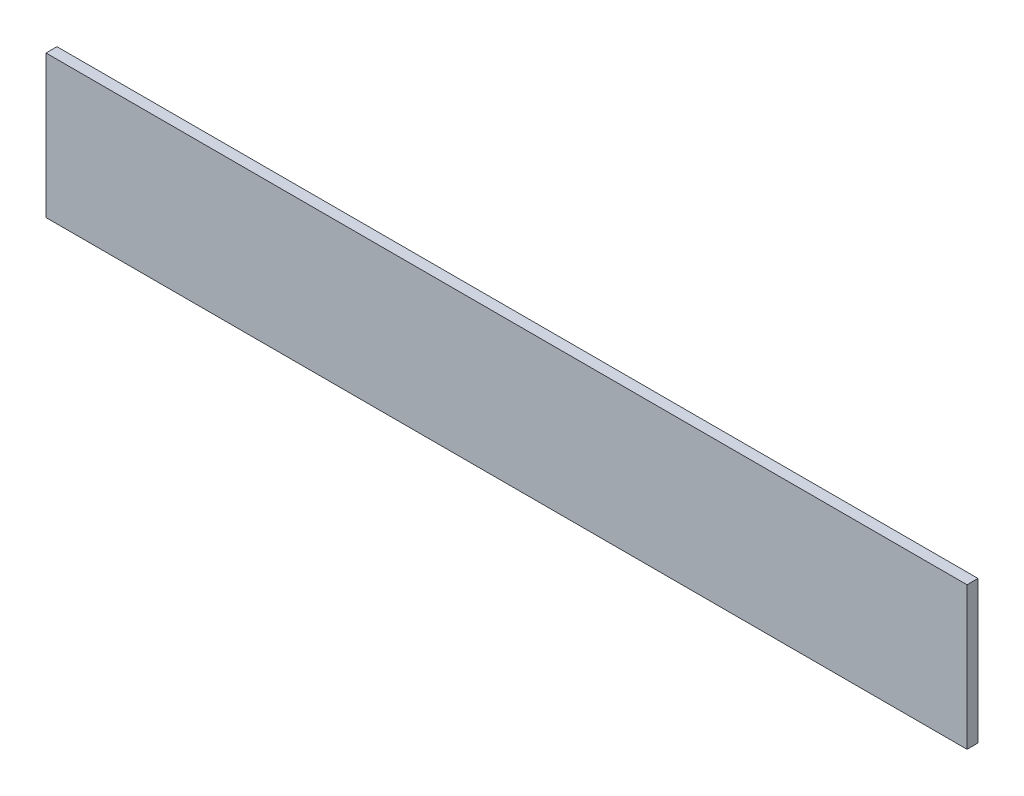
ISO-10303-21;
HEADER;
FILE_DESCRIPTION(('STEP AP214'),'2;1');
FILE_NAME('part.step','',(''),(''),'','','');
FILE_SCHEMA(('AUTOMOTIVE_DESIGN { 1 0 10303 214 1 1 1 1 }'));
ENDSEC;
DATA;
#1=APPLICATION_CONTEXT('core data for automotive mechanical design processes');
#2=APPLICATION_PROTOCOL_DEFINITION('international standard','automotive_design',2000,#1);
#3=PRODUCT_CONTEXT('',#1,'mechanical');
#4=PRODUCT('Part','Part','',(#3));
#5=PRODUCT_RELATED_PRODUCT_CATEGORY('part','',(#4));
#6=PRODUCT_DEFINITION_FORMATION('','',#4);
#7=PRODUCT_DEFINITION_CONTEXT('part definition',#1,'design');
#8=PRODUCT_DEFINITION('design','',#6,#7);
#9=PRODUCT_DEFINITION_SHAPE('','',#8);
#10=(LENGTH_UNIT() NAMED_UNIT(*) SI_UNIT(.MILLI.,.METRE.));
#11=(NAMED_UNIT(*) PLANE_ANGLE_UNIT() SI_UNIT($,.RADIAN.));
#12=(NAMED_UNIT(*) SI_UNIT($,.STERADIAN.) SOLID_ANGLE_UNIT());
#13=UNCERTAINTY_MEASURE_WITH_UNIT(LENGTH_MEASURE(1.E-05),#10,'distance_accuracy_value','');
#14=(GEOMETRIC_REPRESENTATION_CONTEXT(3) GLOBAL_UNCERTAINTY_ASSIGNED_CONTEXT((#13)) GLOBAL_UNIT_ASSIGNED_CONTEXT((#10,
#11,#12)) REPRESENTATION_CONTEXT('',''));
#15=CARTESIAN_POINT('',(0.,0.,0.));
#16=DIRECTION('',(0.,0.,1.));
#17=DIRECTION('',(1.,0.,0.));
#18=AXIS2_PLACEMENT_3D('',#15,#16,#17);
#19=CARTESIAN_POINT('',(0.,0.,5.));
#20=DIRECTION('',(1.,0.,0.));
#21=DIRECTION('',(0.,1.,0.));
#22=AXIS2_PLACEMENT_3D('',#19,#20,#21);
#23=PLANE('',#22);
#24=DIRECTION('',(0.,-1.,0.));
#25=VECTOR('',#24,1.);
#26=CARTESIAN_POINT('',(0.,0.,0.));
#27=LINE('',#26,#25);
#28=CARTESIAN_POINT('',(0.,0.,0.));
#29=VERTEX_POINT('',#28);
#30=CARTESIAN_POINT('',(0.,-65.,0.));
#31=VERTEX_POINT('',#30);
#32=EDGE_CURVE('E100',#29,#31,#27,.T.);
#33=ORIENTED_EDGE('',*,*,#32,.T.);
#34=DIRECTION('',(0.,0.,-1.));
#35=VECTOR('',#34,1.);
#36=CARTESIAN_POINT('',(0.,-65.,5.));
#37=LINE('',#36,#35);
#38=CARTESIAN_POINT('',(0.,-65.,5.));
#39=VERTEX_POINT('',#38);
#40=EDGE_CURVE('E11',#39,#31,#37,.T.);
#41=ORIENTED_EDGE('',*,*,#40,.F.);
#42=DIRECTION('',(0.,-1.,0.));
#43=VECTOR('',#42,1.);
#44=CARTESIAN_POINT('',(0.,0.,5.));
#45=LINE('',#44,#43);
#46=CARTESIAN_POINT('',(0.,0.,5.));
#47=VERTEX_POINT('',#46);
#48=EDGE_CURVE('E88',#47,#39,#45,.T.);
#49=ORIENTED_EDGE('',*,*,#48,.F.);
#50=DIRECTION('',(0.,0.,-1.));
#51=VECTOR('',#50,1.);
#52=CARTESIAN_POINT('',(0.,0.,5.));
#53=LINE('',#52,#51);
#54=EDGE_CURVE('E96',#47,#29,#53,.T.);
#55=ORIENTED_EDGE('',*,*,#54,.T.);
#56=EDGE_LOOP('',(#33,#41,#49,#55));
#57=FACE_BOUND('',#56,.T.);
#58=ADVANCED_FACE('F37',(#57),#23,.F.);
#59=CARTESIAN_POINT('',(0.,-65.,5.));
#60=DIRECTION('',(0.,1.,0.));
#61=DIRECTION('',(0.,0.,1.));
#62=AXIS2_PLACEMENT_3D('',#59,#60,#61);
#63=PLANE('',#62);
#64=DIRECTION('',(1.,0.,0.));
#65=VECTOR('',#64,1.);
#66=CARTESIAN_POINT('',(0.,-65.,0.));
#67=LINE('',#66,#65);
#68=CARTESIAN_POINT('',(420.,-65.,0.));
#69=VERTEX_POINT('',#68);
#70=EDGE_CURVE('E92',#31,#69,#67,.T.);
#71=ORIENTED_EDGE('',*,*,#70,.T.);
#72=DIRECTION('',(0.,0.,-1.));
#73=VECTOR('',#72,1.);
#74=CARTESIAN_POINT('',(420.,-65.,5.));
#75=LINE('',#74,#73);
#76=CARTESIAN_POINT('',(420.,-65.,5.));
#77=VERTEX_POINT('',#76);
#78=EDGE_CURVE('E45',#77,#69,#75,.T.);
#79=ORIENTED_EDGE('',*,*,#78,.F.);
#80=DIRECTION('',(1.,0.,0.));
#81=VECTOR('',#80,1.);
#82=CARTESIAN_POINT('',(0.,-65.,5.));
#83=LINE('',#82,#81);
#84=EDGE_CURVE('E83',#39,#77,#83,.T.);
#85=ORIENTED_EDGE('',*,*,#84,.F.);
#86=ORIENTED_EDGE('',*,*,#40,.T.);
#87=EDGE_LOOP('',(#71,#79,#85,#86));
#88=FACE_BOUND('',#87,.T.);
#89=ADVANCED_FACE('F91',(#88),#63,.F.);
#90=CARTESIAN_POINT('',(420.,0.,5.));
#91=DIRECTION('',(-1.,0.,0.));
#92=DIRECTION('',(0.,0.,1.));
#93=AXIS2_PLACEMENT_3D('',#90,#91,#92);
#94=PLANE('',#93);
#95=DIRECTION('',(0.,1.,0.));
#96=VECTOR('',#95,1.);
#97=CARTESIAN_POINT('',(420.,0.,0.));
#98=LINE('',#97,#96);
#99=CARTESIAN_POINT('',(420.,0.,0.));
#100=VERTEX_POINT('',#99);
#101=EDGE_CURVE('E70',#69,#100,#98,.T.);
#102=ORIENTED_EDGE('',*,*,#101,.T.);
#103=DIRECTION('',(0.,0.,-1.));
#104=VECTOR('',#103,1.);
#105=CARTESIAN_POINT('',(420.,0.,5.));
#106=LINE('',#105,#104);
#107=CARTESIAN_POINT('',(420.,0.,5.));
#108=VERTEX_POINT('',#107);
#109=EDGE_CURVE('E93',#108,#100,#106,.T.);
#110=ORIENTED_EDGE('',*,*,#109,.F.);
#111=DIRECTION('',(0.,1.,0.));
#112=VECTOR('',#111,1.);
#113=CARTESIAN_POINT('',(420.,0.,5.));
#114=LINE('',#113,#112);
#115=EDGE_CURVE('E86',#77,#108,#114,.T.);
#116=ORIENTED_EDGE('',*,*,#115,.F.);
#117=ORIENTED_EDGE('',*,*,#78,.T.);
#118=EDGE_LOOP('',(#102,#110,#116,#117));
#119=FACE_BOUND('',#118,.T.);
#120=ADVANCED_FACE('F94',(#119),#94,.F.);
#121=CARTESIAN_POINT('',(0.,0.,5.));
#122=DIRECTION('',(0.,-1.,0.));
#123=DIRECTION('',(0.,0.,-1.));
#124=AXIS2_PLACEMENT_3D('',#121,#122,#123);
#125=PLANE('',#124);
#126=DIRECTION('',(-1.,0.,0.));
#127=VECTOR('',#126,1.);
#128=CARTESIAN_POINT('',(0.,0.,0.));
#129=LINE('',#128,#127);
#130=EDGE_CURVE('E76',#100,#29,#129,.T.);
#131=ORIENTED_EDGE('',*,*,#130,.T.);
#132=ORIENTED_EDGE('',*,*,#54,.F.);
#133=DIRECTION('',(-1.,0.,0.));
#134=VECTOR('',#133,1.);
#135=CARTESIAN_POINT('',(0.,0.,5.));
#136=LINE('',#135,#134);
#137=EDGE_CURVE('E53',#108,#47,#136,.T.);
#138=ORIENTED_EDGE('',*,*,#137,.F.);
#139=ORIENTED_EDGE('',*,*,#109,.T.);
#140=EDGE_LOOP('',(#131,#132,#138,#139));
#141=FACE_BOUND('',#140,.T.);
#142=ADVANCED_FACE('F107',(#141),#125,.F.);
#143=CARTESIAN_POINT('',(0.,0.,5.));
#144=DIRECTION('',(0.,0.,1.));
#145=DIRECTION('',(1.,0.,0.));
#146=AXIS2_PLACEMENT_3D('',#143,#144,#145);
#147=PLANE('',#146);
#148=ORIENTED_EDGE('',*,*,#48,.T.);
#149=ORIENTED_EDGE('',*,*,#84,.T.);
#150=ORIENTED_EDGE('',*,*,#115,.T.);
#151=ORIENTED_EDGE('',*,*,#137,.T.);
#152=EDGE_LOOP('',(#148,#149,#150,#151));
#153=FACE_BOUND('',#152,.T.);
#154=ADVANCED_FACE('F84',(#153),#147,.T.);
#155=CARTESIAN_POINT('',(0.,0.,0.));
#156=DIRECTION('',(0.,0.,1.));
#157=DIRECTION('',(1.,0.,0.));
#158=AXIS2_PLACEMENT_3D('',#155,#156,#157);
#159=PLANE('',#158);
#160=ORIENTED_EDGE('',*,*,#32,.F.);
#161=ORIENTED_EDGE('',*,*,#130,.F.);
#162=ORIENTED_EDGE('',*,*,#101,.F.);
#163=ORIENTED_EDGE('',*,*,#70,.F.);
#164=EDGE_LOOP('',(#160,#161,#162,#163));
#165=FACE_BOUND('',#164,.T.);
#166=ADVANCED_FACE('F110',(#165),#159,.F.);
#167=CLOSED_SHELL('',(#58,#89,#120,#142,#154,#166));
#168=MANIFOLD_SOLID_BREP('B2',#167);
#169=ADVANCED_BREP_SHAPE_REPRESENTATION('',(#18,#168),#14);
#170=SHAPE_DEFINITION_REPRESENTATION(#9,#169);
ENDSEC;
END-ISO-10303-21;
